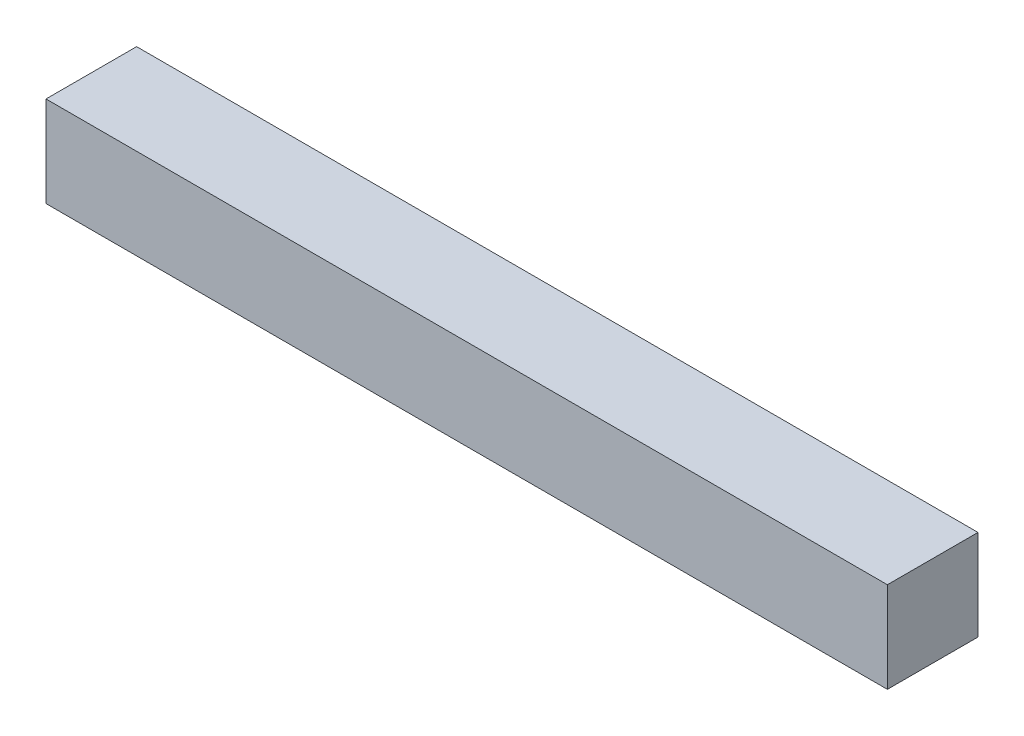
ISO-10303-21;
HEADER;
FILE_DESCRIPTION(('STEP AP214'),'2;1');
FILE_NAME('part.step','',(''),(''),'','','');
FILE_SCHEMA(('AUTOMOTIVE_DESIGN { 1 0 10303 214 1 1 1 1 }'));
ENDSEC;
DATA;
#1=APPLICATION_CONTEXT('core data for automotive mechanical design processes');
#2=APPLICATION_PROTOCOL_DEFINITION('international standard','automotive_design',2000,#1);
#3=PRODUCT_CONTEXT('',#1,'mechanical');
#4=PRODUCT('Part','Part','',(#3));
#5=PRODUCT_RELATED_PRODUCT_CATEGORY('part','',(#4));
#6=PRODUCT_DEFINITION_FORMATION('','',#4);
#7=PRODUCT_DEFINITION_CONTEXT('part definition',#1,'design');
#8=PRODUCT_DEFINITION('design','',#6,#7);
#9=PRODUCT_DEFINITION_SHAPE('','',#8);
#10=(LENGTH_UNIT() NAMED_UNIT(*) SI_UNIT(.MILLI.,.METRE.));
#11=(NAMED_UNIT(*) PLANE_ANGLE_UNIT() SI_UNIT($,.RADIAN.));
#12=(NAMED_UNIT(*) SI_UNIT($,.STERADIAN.) SOLID_ANGLE_UNIT());
#13=UNCERTAINTY_MEASURE_WITH_UNIT(LENGTH_MEASURE(1.E-05),#10,'distance_accuracy_value','');
#14=(GEOMETRIC_REPRESENTATION_CONTEXT(3) GLOBAL_UNCERTAINTY_ASSIGNED_CONTEXT((#13)) GLOBAL_UNIT_ASSIGNED_CONTEXT((#10,
#11,#12)) REPRESENTATION_CONTEXT('',''));
#15=CARTESIAN_POINT('',(0.,0.,0.));
#16=DIRECTION('',(0.,0.,1.));
#17=DIRECTION('',(1.,0.,0.));
#18=AXIS2_PLACEMENT_3D('',#15,#16,#17);
#19=CARTESIAN_POINT('',(130.,-14.,28.));
#20=DIRECTION('',(-1.,0.,0.));
#21=DIRECTION('',(0.,0.,1.));
#22=AXIS2_PLACEMENT_3D('',#19,#20,#21);
#23=PLANE('',#22);
#24=DIRECTION('',(0.,1.,0.));
#25=VECTOR('',#24,1.);
#26=CARTESIAN_POINT('',(130.,-14.,0.));
#27=LINE('',#26,#25);
#28=CARTESIAN_POINT('',(130.,-14.,0.));
#29=VERTEX_POINT('',#28);
#30=CARTESIAN_POINT('',(130.,14.,0.));
#31=VERTEX_POINT('',#30);
#32=EDGE_CURVE('E113',#29,#31,#27,.T.);
#33=ORIENTED_EDGE('',*,*,#32,.T.);
#34=DIRECTION('',(0.,0.,-1.));
#35=VECTOR('',#34,1.);
#36=CARTESIAN_POINT('',(130.,14.,28.));
#37=LINE('',#36,#35);
#38=CARTESIAN_POINT('',(130.,14.,28.));
#39=VERTEX_POINT('',#38);
#40=EDGE_CURVE('E11',#39,#31,#37,.T.);
#41=ORIENTED_EDGE('',*,*,#40,.F.);
#42=DIRECTION('',(0.,1.,0.));
#43=VECTOR('',#42,1.);
#44=CARTESIAN_POINT('',(130.,-14.,28.));
#45=LINE('',#44,#43);
#46=CARTESIAN_POINT('',(130.,-14.,28.));
#47=VERTEX_POINT('',#46);
#48=EDGE_CURVE('E97',#47,#39,#45,.T.);
#49=ORIENTED_EDGE('',*,*,#48,.F.);
#50=DIRECTION('',(0.,0.,-1.));
#51=VECTOR('',#50,1.);
#52=CARTESIAN_POINT('',(130.,-14.,28.));
#53=LINE('',#52,#51);
#54=EDGE_CURVE('E109',#47,#29,#53,.T.);
#55=ORIENTED_EDGE('',*,*,#54,.T.);
#56=EDGE_LOOP('',(#33,#41,#49,#55));
#57=FACE_BOUND('',#56,.T.);
#58=ADVANCED_FACE('F45',(#57),#23,.F.);
#59=CARTESIAN_POINT('',(-130.,14.,28.));
#60=DIRECTION('',(0.,-1.,0.));
#61=DIRECTION('',(0.,0.,-1.));
#62=AXIS2_PLACEMENT_3D('',#59,#60,#61);
#63=PLANE('',#62);
#64=DIRECTION('',(-1.,0.,0.));
#65=VECTOR('',#64,1.);
#66=CARTESIAN_POINT('',(-130.,14.,0.));
#67=LINE('',#66,#65);
#68=CARTESIAN_POINT('',(-130.,14.,0.));
#69=VERTEX_POINT('',#68);
#70=EDGE_CURVE('E102',#31,#69,#67,.T.);
#71=ORIENTED_EDGE('',*,*,#70,.T.);
#72=DIRECTION('',(0.,0.,-1.));
#73=VECTOR('',#72,1.);
#74=CARTESIAN_POINT('',(-130.,14.,28.));
#75=LINE('',#74,#73);
#76=CARTESIAN_POINT('',(-130.,14.,28.));
#77=VERTEX_POINT('',#76);
#78=EDGE_CURVE('E54',#77,#69,#75,.T.);
#79=ORIENTED_EDGE('',*,*,#78,.F.);
#80=DIRECTION('',(-1.,0.,0.));
#81=VECTOR('',#80,1.);
#82=CARTESIAN_POINT('',(-130.,14.,28.));
#83=LINE('',#82,#81);
#84=EDGE_CURVE('E92',#39,#77,#83,.T.);
#85=ORIENTED_EDGE('',*,*,#84,.F.);
#86=ORIENTED_EDGE('',*,*,#40,.T.);
#87=EDGE_LOOP('',(#71,#79,#85,#86));
#88=FACE_BOUND('',#87,.T.);
#89=ADVANCED_FACE('F101',(#88),#63,.F.);
#90=CARTESIAN_POINT('',(-130.,-14.,28.));
#91=DIRECTION('',(1.,0.,0.));
#92=DIRECTION('',(0.,0.,-1.));
#93=AXIS2_PLACEMENT_3D('',#90,#91,#92);
#94=PLANE('',#93);
#95=DIRECTION('',(0.,-1.,0.));
#96=VECTOR('',#95,1.);
#97=CARTESIAN_POINT('',(-130.,-14.,0.));
#98=LINE('',#97,#96);
#99=CARTESIAN_POINT('',(-130.,-14.,0.));
#100=VERTEX_POINT('',#99);
#101=EDGE_CURVE('E79',#69,#100,#98,.T.);
#102=ORIENTED_EDGE('',*,*,#101,.T.);
#103=DIRECTION('',(0.,0.,-1.));
#104=VECTOR('',#103,1.);
#105=CARTESIAN_POINT('',(-130.,-14.,28.));
#106=LINE('',#105,#104);
#107=CARTESIAN_POINT('',(-130.,-14.,28.));
#108=VERTEX_POINT('',#107);
#109=EDGE_CURVE('E104',#108,#100,#106,.T.);
#110=ORIENTED_EDGE('',*,*,#109,.F.);
#111=DIRECTION('',(0.,-1.,0.));
#112=VECTOR('',#111,1.);
#113=CARTESIAN_POINT('',(-130.,-14.,28.));
#114=LINE('',#113,#112);
#115=EDGE_CURVE('E95',#77,#108,#114,.T.);
#116=ORIENTED_EDGE('',*,*,#115,.F.);
#117=ORIENTED_EDGE('',*,*,#78,.T.);
#118=EDGE_LOOP('',(#102,#110,#116,#117));
#119=FACE_BOUND('',#118,.T.);
#120=ADVANCED_FACE('F105',(#119),#94,.F.);
#121=CARTESIAN_POINT('',(-130.,-14.,28.));
#122=DIRECTION('',(0.,1.,0.));
#123=DIRECTION('',(0.,0.,1.));
#124=AXIS2_PLACEMENT_3D('',#121,#122,#123);
#125=PLANE('',#124);
#126=DIRECTION('',(1.,0.,0.));
#127=VECTOR('',#126,1.);
#128=CARTESIAN_POINT('',(-130.,-14.,0.));
#129=LINE('',#128,#127);
#130=EDGE_CURVE('E85',#100,#29,#129,.T.);
#131=ORIENTED_EDGE('',*,*,#130,.T.);
#132=ORIENTED_EDGE('',*,*,#54,.F.);
#133=DIRECTION('',(1.,0.,0.));
#134=VECTOR('',#133,1.);
#135=CARTESIAN_POINT('',(-130.,-14.,28.));
#136=LINE('',#135,#134);
#137=EDGE_CURVE('E62',#108,#47,#136,.T.);
#138=ORIENTED_EDGE('',*,*,#137,.F.);
#139=ORIENTED_EDGE('',*,*,#109,.T.);
#140=EDGE_LOOP('',(#131,#132,#138,#139));
#141=FACE_BOUND('',#140,.T.);
#142=ADVANCED_FACE('F126',(#141),#125,.F.);
#143=CARTESIAN_POINT('',(0.,0.,28.));
#144=DIRECTION('',(0.,0.,-1.));
#145=DIRECTION('',(-1.,0.,0.));
#146=AXIS2_PLACEMENT_3D('',#143,#144,#145);
#147=PLANE('',#146);
#148=ORIENTED_EDGE('',*,*,#48,.T.);
#149=ORIENTED_EDGE('',*,*,#84,.T.);
#150=ORIENTED_EDGE('',*,*,#115,.T.);
#151=ORIENTED_EDGE('',*,*,#137,.T.);
#152=EDGE_LOOP('',(#148,#149,#150,#151));
#153=FACE_BOUND('',#152,.T.);
#154=ADVANCED_FACE('F93',(#153),#147,.F.);
#155=CARTESIAN_POINT('',(0.,0.,0.));
#156=DIRECTION('',(0.,0.,-1.));
#157=DIRECTION('',(-1.,0.,0.));
#158=AXIS2_PLACEMENT_3D('',#155,#156,#157);
#159=PLANE('',#158);
#160=ORIENTED_EDGE('',*,*,#32,.F.);
#161=ORIENTED_EDGE('',*,*,#130,.F.);
#162=ORIENTED_EDGE('',*,*,#101,.F.);
#163=ORIENTED_EDGE('',*,*,#70,.F.);
#164=EDGE_LOOP('',(#160,#161,#162,#163));
#165=FACE_BOUND('',#164,.T.);
#166=ADVANCED_FACE('F129',(#165),#159,.T.);
#167=CLOSED_SHELL('',(#58,#89,#120,#142,#154,#166));
#168=MANIFOLD_SOLID_BREP('B2',#167);
#169=ADVANCED_BREP_SHAPE_REPRESENTATION('',(#18,#168),#14);
#170=SHAPE_DEFINITION_REPRESENTATION(#9,#169);
ENDSEC;
END-ISO-10303-21;
